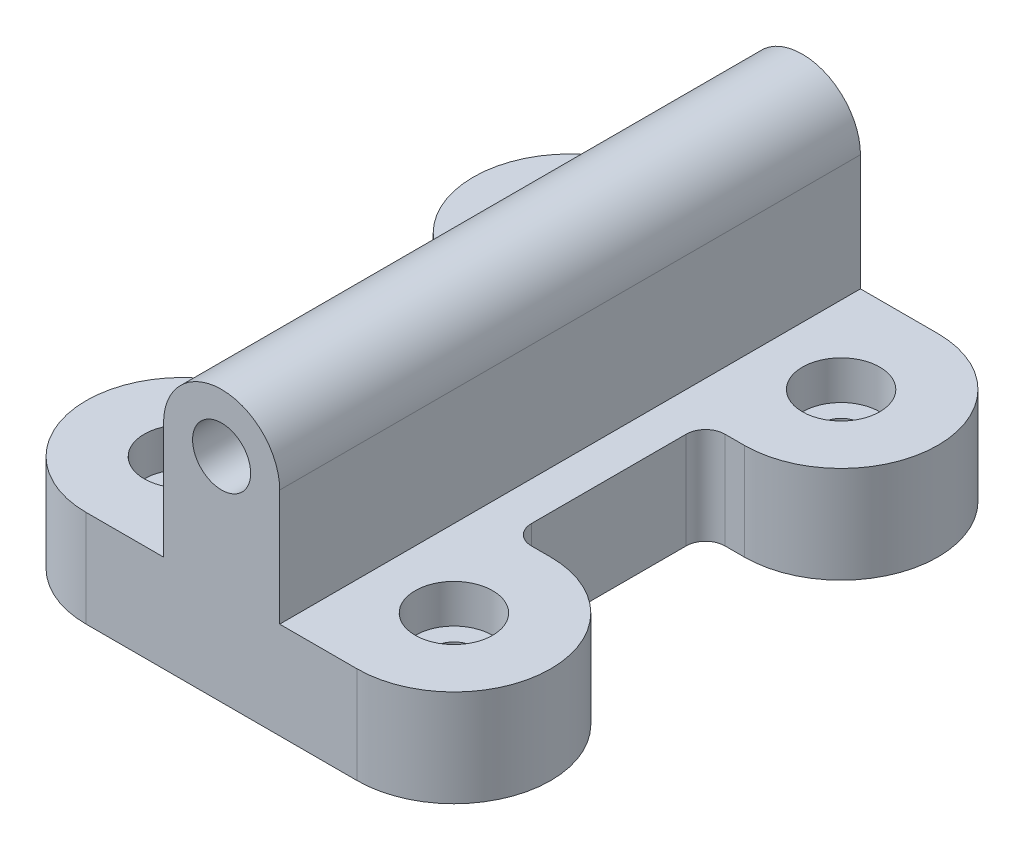
ISO-10303-21;
HEADER;
FILE_DESCRIPTION(('STEP AP214'),'2;1');
FILE_NAME('part.step','',(''),(''),'','','');
FILE_SCHEMA(('AUTOMOTIVE_DESIGN { 1 0 10303 214 1 1 1 1 }'));
ENDSEC;
DATA;
#1=APPLICATION_CONTEXT('core data for automotive mechanical design processes');
#2=APPLICATION_PROTOCOL_DEFINITION('international standard','automotive_design',2000,#1);
#3=PRODUCT_CONTEXT('',#1,'mechanical');
#4=PRODUCT('Part','Part','',(#3));
#5=PRODUCT_RELATED_PRODUCT_CATEGORY('part','',(#4));
#6=PRODUCT_DEFINITION_FORMATION('','',#4);
#7=PRODUCT_DEFINITION_CONTEXT('part definition',#1,'design');
#8=PRODUCT_DEFINITION('design','',#6,#7);
#9=PRODUCT_DEFINITION_SHAPE('','',#8);
#10=(LENGTH_UNIT() NAMED_UNIT(*) SI_UNIT(.MILLI.,.METRE.));
#11=(NAMED_UNIT(*) PLANE_ANGLE_UNIT() SI_UNIT($,.RADIAN.));
#12=(NAMED_UNIT(*) SI_UNIT($,.STERADIAN.) SOLID_ANGLE_UNIT());
#13=UNCERTAINTY_MEASURE_WITH_UNIT(LENGTH_MEASURE(1.E-05),#10,'distance_accuracy_value','');
#14=(GEOMETRIC_REPRESENTATION_CONTEXT(3) GLOBAL_UNCERTAINTY_ASSIGNED_CONTEXT((#13)) GLOBAL_UNIT_ASSIGNED_CONTEXT((#10,
#11,#12)) REPRESENTATION_CONTEXT('',''));
#15=CARTESIAN_POINT('',(0.,0.,0.));
#16=DIRECTION('',(0.,0.,1.));
#17=DIRECTION('',(1.,0.,0.));
#18=AXIS2_PLACEMENT_3D('',#15,#16,#17);
#19=CARTESIAN_POINT('',(-21.8193895180757,5.,-13.4558138102428));
#20=DIRECTION('',(0.,-1.,0.));
#21=DIRECTION('',(0.,0.,-1.));
#22=AXIS2_PLACEMENT_3D('',#19,#20,#21);
#23=CYLINDRICAL_SURFACE('',#22,1.);
#24=CARTESIAN_POINT('',(-21.8193895180757,0.,-13.4558138102428));
#25=DIRECTION('',(0.,1.,0.));
#26=DIRECTION('',(0.,0.,1.));
#27=AXIS2_PLACEMENT_3D('',#24,#25,#26);
#28=CIRCLE('',#27,1.);
#29=CARTESIAN_POINT('',(-21.8193895180757,0.,-12.4558138102428));
#30=VERTEX_POINT('',#29);
#31=EDGE_CURVE('E231',#30,#30,#28,.T.);
#32=ORIENTED_EDGE('',*,*,#31,.F.);
#33=EDGE_LOOP('',(#32));
#34=FACE_BOUND('',#33,.T.);
#35=CARTESIAN_POINT('',(-21.8193895180757,3.,-13.4558138102428));
#36=DIRECTION('',(0.,1.,0.));
#37=DIRECTION('',(0.,0.,1.));
#38=AXIS2_PLACEMENT_3D('',#35,#36,#37);
#39=CIRCLE('',#38,1.);
#40=CARTESIAN_POINT('',(-21.8193895180757,3.,-12.4558138102428));
#41=VERTEX_POINT('',#40);
#42=EDGE_CURVE('E43',#41,#41,#39,.T.);
#43=ORIENTED_EDGE('',*,*,#42,.T.);
#44=EDGE_LOOP('',(#43));
#45=FACE_BOUND('',#44,.T.);
#46=ADVANCED_FACE('F39',(#34,#45),#23,.F.);
#47=CARTESIAN_POINT('',(-7.8193895180757,5.,-13.4558138102428));
#48=DIRECTION('',(0.,-1.,0.));
#49=DIRECTION('',(0.,0.,-1.));
#50=AXIS2_PLACEMENT_3D('',#47,#48,#49);
#51=CYLINDRICAL_SURFACE('',#50,1.);
#52=CARTESIAN_POINT('',(-7.8193895180757,0.,-13.4558138102428));
#53=DIRECTION('',(0.,1.,0.));
#54=DIRECTION('',(0.,0.,1.));
#55=AXIS2_PLACEMENT_3D('',#52,#53,#54);
#56=CIRCLE('',#55,1.);
#57=CARTESIAN_POINT('',(-7.8193895180757,0.,-12.4558138102428));
#58=VERTEX_POINT('',#57);
#59=EDGE_CURVE('E228',#58,#58,#56,.T.);
#60=ORIENTED_EDGE('',*,*,#59,.F.);
#61=EDGE_LOOP('',(#60));
#62=FACE_BOUND('',#61,.T.);
#63=CARTESIAN_POINT('',(-7.8193895180757,3.,-13.4558138102428));
#64=DIRECTION('',(0.,1.,0.));
#65=DIRECTION('',(0.,0.,1.));
#66=AXIS2_PLACEMENT_3D('',#63,#64,#65);
#67=CIRCLE('',#66,1.);
#68=CARTESIAN_POINT('',(-7.8193895180757,3.,-12.4558138102428));
#69=VERTEX_POINT('',#68);
#70=EDGE_CURVE('E207',#69,#69,#67,.T.);
#71=ORIENTED_EDGE('',*,*,#70,.T.);
#72=EDGE_LOOP('',(#71));
#73=FACE_BOUND('',#72,.T.);
#74=ADVANCED_FACE('F353',(#62,#73),#51,.F.);
#75=CARTESIAN_POINT('',(-21.8193895180757,5.,-33.4558138102428));
#76=DIRECTION('',(0.,-1.,0.));
#77=DIRECTION('',(0.,0.,-1.));
#78=AXIS2_PLACEMENT_3D('',#75,#76,#77);
#79=CYLINDRICAL_SURFACE('',#78,1.);
#80=CARTESIAN_POINT('',(-21.8193895180757,0.,-33.4558138102428));
#81=DIRECTION('',(0.,1.,0.));
#82=DIRECTION('',(0.,0.,1.));
#83=AXIS2_PLACEMENT_3D('',#80,#81,#82);
#84=CIRCLE('',#83,1.);
#85=CARTESIAN_POINT('',(-21.8193895180757,0.,-32.4558138102428));
#86=VERTEX_POINT('',#85);
#87=EDGE_CURVE('E225',#86,#86,#84,.T.);
#88=ORIENTED_EDGE('',*,*,#87,.F.);
#89=EDGE_LOOP('',(#88));
#90=FACE_BOUND('',#89,.T.);
#91=CARTESIAN_POINT('',(-21.8193895180757,3.,-33.4558138102428));
#92=DIRECTION('',(0.,1.,0.));
#93=DIRECTION('',(0.,0.,1.));
#94=AXIS2_PLACEMENT_3D('',#91,#92,#93);
#95=CIRCLE('',#94,1.);
#96=CARTESIAN_POINT('',(-21.8193895180757,3.,-32.4558138102428));
#97=VERTEX_POINT('',#96);
#98=EDGE_CURVE('E347',#97,#97,#95,.T.);
#99=ORIENTED_EDGE('',*,*,#98,.T.);
#100=EDGE_LOOP('',(#99));
#101=FACE_BOUND('',#100,.T.);
#102=ADVANCED_FACE('F484',(#90,#101),#79,.F.);
#103=CARTESIAN_POINT('',(-7.8193895180757,5.,-33.4558138102428));
#104=DIRECTION('',(0.,-1.,0.));
#105=DIRECTION('',(0.,0.,-1.));
#106=AXIS2_PLACEMENT_3D('',#103,#104,#105);
#107=CYLINDRICAL_SURFACE('',#106,1.);
#108=CARTESIAN_POINT('',(-7.8193895180757,0.,-33.4558138102428));
#109=DIRECTION('',(0.,1.,0.));
#110=DIRECTION('',(0.,0.,1.));
#111=AXIS2_PLACEMENT_3D('',#108,#109,#110);
#112=CIRCLE('',#111,1.);
#113=CARTESIAN_POINT('',(-7.8193895180757,0.,-32.4558138102428));
#114=VERTEX_POINT('',#113);
#115=EDGE_CURVE('E222',#114,#114,#112,.T.);
#116=ORIENTED_EDGE('',*,*,#115,.F.);
#117=EDGE_LOOP('',(#116));
#118=FACE_BOUND('',#117,.T.);
#119=CARTESIAN_POINT('',(-7.8193895180757,3.,-33.4558138102428));
#120=DIRECTION('',(0.,1.,0.));
#121=DIRECTION('',(0.,0.,1.));
#122=AXIS2_PLACEMENT_3D('',#119,#120,#121);
#123=CIRCLE('',#122,1.);
#124=CARTESIAN_POINT('',(-7.8193895180757,3.,-32.4558138102428));
#125=VERTEX_POINT('',#124);
#126=EDGE_CURVE('E344',#125,#125,#123,.T.);
#127=ORIENTED_EDGE('',*,*,#126,.T.);
#128=EDGE_LOOP('',(#127));
#129=FACE_BOUND('',#128,.T.);
#130=ADVANCED_FACE('F667',(#118,#129),#107,.F.);
#131=CARTESIAN_POINT('',(-21.8193895180757,5.,-13.4558138102428));
#132=DIRECTION('',(0.,1.,0.));
#133=DIRECTION('',(0.,0.,1.));
#134=AXIS2_PLACEMENT_3D('',#131,#132,#133);
#135=PLANE('',#134);
#136=CARTESIAN_POINT('',(-7.8193895180757,5.,-33.4558138102428));
#137=DIRECTION('',(0.,1.,0.));
#138=DIRECTION('',(0.,0.,1.));
#139=AXIS2_PLACEMENT_3D('',#136,#137,#138);
#140=CIRCLE('',#139,2.);
#141=CARTESIAN_POINT('',(-7.8193895180757,5.,-31.4558138102428));
#142=VERTEX_POINT('',#141);
#143=EDGE_CURVE('E371',#142,#142,#140,.T.);
#144=ORIENTED_EDGE('',*,*,#143,.F.);
#145=EDGE_LOOP('',(#144));
#146=FACE_BOUND('',#145,.T.);
#147=CARTESIAN_POINT('',(-7.8193895180757,5.,-13.4558138102428));
#148=DIRECTION('',(0.,1.,0.));
#149=DIRECTION('',(0.,0.,1.));
#150=AXIS2_PLACEMENT_3D('',#147,#148,#149);
#151=CIRCLE('',#150,2.);
#152=CARTESIAN_POINT('',(-7.8193895180757,5.,-11.4558138102428));
#153=VERTEX_POINT('',#152);
#154=EDGE_CURVE('E365',#153,#153,#151,.T.);
#155=ORIENTED_EDGE('',*,*,#154,.F.);
#156=EDGE_LOOP('',(#155));
#157=FACE_BOUND('',#156,.T.);
#158=DIRECTION('',(-1.,0.,0.));
#159=VECTOR('',#158,1.);
#160=CARTESIAN_POINT('',(-21.8193895180757,5.,-38.4558138102428));
#161=LINE('',#160,#159);
#162=CARTESIAN_POINT('',(-7.8193895180757,5.,-38.4558138102428));
#163=VERTEX_POINT('',#162);
#164=CARTESIAN_POINT('',(-11.8193895180757,5.,-38.4558138102428));
#165=VERTEX_POINT('',#164);
#166=EDGE_CURVE('E64',#163,#165,#161,.T.);
#167=ORIENTED_EDGE('',*,*,#166,.T.);
#168=DIRECTION('',(0.,0.,1.));
#169=VECTOR('',#168,1.);
#170=CARTESIAN_POINT('',(-11.8193895180757,5.,-49.2724676366348));
#171=LINE('',#170,#169);
#172=CARTESIAN_POINT('',(-11.8193895180757,5.,-8.45581381024279));
#173=VERTEX_POINT('',#172);
#174=EDGE_CURVE('E214',#165,#173,#171,.T.);
#175=ORIENTED_EDGE('',*,*,#174,.T.);
#176=DIRECTION('',(1.,0.,0.));
#177=VECTOR('',#176,1.);
#178=CARTESIAN_POINT('',(-21.8193895180757,5.,-8.45581381024279));
#179=LINE('',#178,#177);
#180=CARTESIAN_POINT('',(-7.8193895180757,5.,-8.45581381024279));
#181=VERTEX_POINT('',#180);
#182=EDGE_CURVE('E204',#173,#181,#179,.T.);
#183=ORIENTED_EDGE('',*,*,#182,.T.);
#184=CARTESIAN_POINT('',(-7.8193895180757,5.,-13.4558138102428));
#185=DIRECTION('',(0.,1.,0.));
#186=DIRECTION('',(0.,0.,1.));
#187=AXIS2_PLACEMENT_3D('',#184,#185,#186);
#188=CIRCLE('',#187,5.);
#189=CARTESIAN_POINT('',(-7.8193895180757,5.,-18.4558138102428));
#190=VERTEX_POINT('',#189);
#191=EDGE_CURVE('E241',#181,#190,#188,.T.);
#192=ORIENTED_EDGE('',*,*,#191,.T.);
#193=DIRECTION('',(-1.,0.,0.));
#194=VECTOR('',#193,1.);
#195=CARTESIAN_POINT('',(-7.8193895180757,5.,-18.4558138102428));
#196=LINE('',#195,#194);
#197=CARTESIAN_POINT('',(-8.8193895180757,5.,-18.4558138102428));
#198=VERTEX_POINT('',#197);
#199=EDGE_CURVE('E243',#190,#198,#196,.T.);
#200=ORIENTED_EDGE('',*,*,#199,.T.);
#201=CARTESIAN_POINT('',(-8.8193895180757,5.,-19.4558138102428));
#202=DIRECTION('',(0.,-1.,0.));
#203=DIRECTION('',(0.,0.,1.));
#204=AXIS2_PLACEMENT_3D('',#201,#202,#203);
#205=CIRCLE('',#204,1.);
#206=CARTESIAN_POINT('',(-9.8193895180757,5.,-19.4558138102428));
#207=VERTEX_POINT('',#206);
#208=EDGE_CURVE('E245',#198,#207,#205,.T.);
#209=ORIENTED_EDGE('',*,*,#208,.T.);
#210=DIRECTION('',(0.,0.,-1.));
#211=VECTOR('',#210,1.);
#212=CARTESIAN_POINT('',(-9.8193895180757,5.,-27.4558138102428));
#213=LINE('',#212,#211);
#214=CARTESIAN_POINT('',(-9.8193895180757,5.,-27.4558138102428));
#215=VERTEX_POINT('',#214);
#216=EDGE_CURVE('E247',#207,#215,#213,.T.);
#217=ORIENTED_EDGE('',*,*,#216,.T.);
#218=CARTESIAN_POINT('',(-8.8193895180757,5.,-27.4558138102428));
#219=DIRECTION('',(0.,-1.,0.));
#220=DIRECTION('',(0.,0.,-1.));
#221=AXIS2_PLACEMENT_3D('',#218,#219,#220);
#222=CIRCLE('',#221,1.);
#223=CARTESIAN_POINT('',(-8.81938951807569,5.,-28.4558138102428));
#224=VERTEX_POINT('',#223);
#225=EDGE_CURVE('E249',#215,#224,#222,.T.);
#226=ORIENTED_EDGE('',*,*,#225,.T.);
#227=DIRECTION('',(1.,0.,0.));
#228=VECTOR('',#227,1.);
#229=CARTESIAN_POINT('',(-7.8193895180757,5.,-28.4558138102428));
#230=LINE('',#229,#228);
#231=CARTESIAN_POINT('',(-7.8193895180757,5.,-28.4558138102428));
#232=VERTEX_POINT('',#231);
#233=EDGE_CURVE('E251',#224,#232,#230,.T.);
#234=ORIENTED_EDGE('',*,*,#233,.T.);
#235=CARTESIAN_POINT('',(-7.8193895180757,5.,-33.4558138102428));
#236=DIRECTION('',(0.,1.,0.));
#237=DIRECTION('',(0.,0.,1.));
#238=AXIS2_PLACEMENT_3D('',#235,#236,#237);
#239=CIRCLE('',#238,5.);
#240=EDGE_CURVE('E253',#232,#163,#239,.T.);
#241=ORIENTED_EDGE('',*,*,#240,.T.);
#242=EDGE_LOOP('',(#167,#175,#183,#192,#200,#209,#217,#226,#234,#241));
#243=FACE_BOUND('',#242,.T.);
#244=ADVANCED_FACE('F450',(#146,#157,#243),#135,.T.);
#245=CARTESIAN_POINT('',(-21.8193895180757,5.,-13.4558138102428));
#246=DIRECTION('',(0.,1.,0.));
#247=DIRECTION('',(0.,0.,1.));
#248=AXIS2_PLACEMENT_3D('',#245,#246,#247);
#249=CIRCLE('',#248,2.);
#250=CARTESIAN_POINT('',(-21.8193895180757,5.,-11.4558138102428));
#251=VERTEX_POINT('',#250);
#252=EDGE_CURVE('E378',#251,#251,#249,.T.);
#253=ORIENTED_EDGE('',*,*,#252,.F.);
#254=EDGE_LOOP('',(#253));
#255=FACE_BOUND('',#254,.T.);
#256=CARTESIAN_POINT('',(-21.8193895180757,5.,-33.4558138102428));
#257=DIRECTION('',(0.,1.,0.));
#258=DIRECTION('',(0.,0.,1.));
#259=AXIS2_PLACEMENT_3D('',#256,#257,#258);
#260=CIRCLE('',#259,2.);
#261=CARTESIAN_POINT('',(-21.8193895180757,5.,-31.4558138102428));
#262=VERTEX_POINT('',#261);
#263=EDGE_CURVE('E374',#262,#262,#260,.T.);
#264=ORIENTED_EDGE('',*,*,#263,.F.);
#265=EDGE_LOOP('',(#264));
#266=FACE_BOUND('',#265,.T.);
#267=DIRECTION('',(0.,0.,1.));
#268=VECTOR('',#267,1.);
#269=CARTESIAN_POINT('',(-17.8193895180757,5.,-49.2724676366348));
#270=LINE('',#269,#268);
#271=CARTESIAN_POINT('',(-17.8193895180757,5.,-38.4558138102428));
#272=VERTEX_POINT('',#271);
#273=CARTESIAN_POINT('',(-17.8193895180757,5.,-8.45581381024279));
#274=VERTEX_POINT('',#273);
#275=EDGE_CURVE('E56',#272,#274,#270,.T.);
#276=ORIENTED_EDGE('',*,*,#275,.F.);
#277=CARTESIAN_POINT('',(-21.8193895180757,5.,-38.4558138102428));
#278=VERTEX_POINT('',#277);
#279=EDGE_CURVE('E255',#272,#278,#161,.T.);
#280=ORIENTED_EDGE('',*,*,#279,.T.);
#281=CARTESIAN_POINT('',(-21.8193895180757,5.,-33.4558138102428));
#282=DIRECTION('',(0.,1.,0.));
#283=DIRECTION('',(0.,0.,1.));
#284=AXIS2_PLACEMENT_3D('',#281,#282,#283);
#285=CIRCLE('',#284,5.);
#286=CARTESIAN_POINT('',(-21.8193895180757,5.,-28.4558138102428));
#287=VERTEX_POINT('',#286);
#288=EDGE_CURVE('E257',#278,#287,#285,.T.);
#289=ORIENTED_EDGE('',*,*,#288,.T.);
#290=DIRECTION('',(1.,0.,0.));
#291=VECTOR('',#290,1.);
#292=CARTESIAN_POINT('',(-21.8193895180757,5.,-28.4558138102428));
#293=LINE('',#292,#291);
#294=CARTESIAN_POINT('',(-20.8193895180757,5.,-28.4558138102428));
#295=VERTEX_POINT('',#294);
#296=EDGE_CURVE('E259',#287,#295,#293,.T.);
#297=ORIENTED_EDGE('',*,*,#296,.T.);
#298=CARTESIAN_POINT('',(-20.8193895180757,5.,-27.4558138102428));
#299=DIRECTION('',(0.,-1.,0.));
#300=DIRECTION('',(0.,0.,1.));
#301=AXIS2_PLACEMENT_3D('',#298,#299,#300);
#302=CIRCLE('',#301,1.);
#303=CARTESIAN_POINT('',(-19.8193895180757,5.,-27.4558138102428));
#304=VERTEX_POINT('',#303);
#305=EDGE_CURVE('E261',#295,#304,#302,.T.);
#306=ORIENTED_EDGE('',*,*,#305,.T.);
#307=DIRECTION('',(0.,0.,1.));
#308=VECTOR('',#307,1.);
#309=CARTESIAN_POINT('',(-19.8193895180757,5.,-19.4558138102428));
#310=LINE('',#309,#308);
#311=CARTESIAN_POINT('',(-19.8193895180757,5.,-19.4558138102428));
#312=VERTEX_POINT('',#311);
#313=EDGE_CURVE('E263',#304,#312,#310,.T.);
#314=ORIENTED_EDGE('',*,*,#313,.T.);
#315=CARTESIAN_POINT('',(-20.8193895180757,5.,-19.4558138102428));
#316=DIRECTION('',(0.,-1.,0.));
#317=DIRECTION('',(0.,0.,-1.));
#318=AXIS2_PLACEMENT_3D('',#315,#316,#317);
#319=CIRCLE('',#318,1.);
#320=CARTESIAN_POINT('',(-20.8193895180757,5.,-18.4558138102428));
#321=VERTEX_POINT('',#320);
#322=EDGE_CURVE('E265',#312,#321,#319,.T.);
#323=ORIENTED_EDGE('',*,*,#322,.T.);
#324=DIRECTION('',(-1.,0.,0.));
#325=VECTOR('',#324,1.);
#326=CARTESIAN_POINT('',(-21.8193895180757,5.,-18.4558138102428));
#327=LINE('',#326,#325);
#328=CARTESIAN_POINT('',(-21.8193895180757,5.,-18.4558138102428));
#329=VERTEX_POINT('',#328);
#330=EDGE_CURVE('E267',#321,#329,#327,.T.);
#331=ORIENTED_EDGE('',*,*,#330,.T.);
#332=CARTESIAN_POINT('',(-21.8193895180757,5.,-13.4558138102428));
#333=DIRECTION('',(0.,1.,0.));
#334=DIRECTION('',(0.,0.,1.));
#335=AXIS2_PLACEMENT_3D('',#332,#333,#334);
#336=CIRCLE('',#335,5.);
#337=CARTESIAN_POINT('',(-21.8193895180757,5.,-8.45581381024279));
#338=VERTEX_POINT('',#337);
#339=EDGE_CURVE('E235',#329,#338,#336,.T.);
#340=ORIENTED_EDGE('',*,*,#339,.T.);
#341=EDGE_CURVE('E239',#338,#274,#179,.T.);
#342=ORIENTED_EDGE('',*,*,#341,.T.);
#343=EDGE_LOOP('',(#276,#280,#289,#297,#306,#314,#323,#331,#340,#342));
#344=FACE_BOUND('',#343,.T.);
#345=ADVANCED_FACE('F396',(#255,#266,#344),#135,.T.);
#346=CARTESIAN_POINT('',(-21.8193895180757,0.,-13.4558138102428));
#347=DIRECTION('',(0.,1.,0.));
#348=DIRECTION('',(0.,0.,1.));
#349=AXIS2_PLACEMENT_3D('',#346,#347,#348);
#350=PLANE('',#349);
#351=CARTESIAN_POINT('',(-21.8193895180757,0.,-13.4558138102428));
#352=DIRECTION('',(0.,1.,0.));
#353=DIRECTION('',(0.,0.,1.));
#354=AXIS2_PLACEMENT_3D('',#351,#352,#353);
#355=CIRCLE('',#354,5.);
#356=CARTESIAN_POINT('',(-21.8193895180757,0.,-18.4558138102428));
#357=VERTEX_POINT('',#356);
#358=CARTESIAN_POINT('',(-21.8193895180757,0.,-8.45581381024279));
#359=VERTEX_POINT('',#358);
#360=EDGE_CURVE('E234',#357,#359,#355,.T.);
#361=ORIENTED_EDGE('',*,*,#360,.F.);
#362=DIRECTION('',(-1.,0.,0.));
#363=VECTOR('',#362,1.);
#364=CARTESIAN_POINT('',(-21.8193895180757,0.,-18.4558138102428));
#365=LINE('',#364,#363);
#366=CARTESIAN_POINT('',(-20.8193895180757,0.,-18.4558138102428));
#367=VERTEX_POINT('',#366);
#368=EDGE_CURVE('E238',#367,#357,#365,.T.);
#369=ORIENTED_EDGE('',*,*,#368,.F.);
#370=CARTESIAN_POINT('',(-20.8193895180757,0.,-19.4558138102428));
#371=DIRECTION('',(0.,-1.,0.));
#372=DIRECTION('',(0.,0.,-1.));
#373=AXIS2_PLACEMENT_3D('',#370,#371,#372);
#374=CIRCLE('',#373,1.);
#375=CARTESIAN_POINT('',(-19.8193895180757,0.,-19.4558138102428));
#376=VERTEX_POINT('',#375);
#377=EDGE_CURVE('E298',#376,#367,#374,.T.);
#378=ORIENTED_EDGE('',*,*,#377,.F.);
#379=DIRECTION('',(0.,0.,1.));
#380=VECTOR('',#379,1.);
#381=CARTESIAN_POINT('',(-19.8193895180757,0.,-19.4558138102428));
#382=LINE('',#381,#380);
#383=CARTESIAN_POINT('',(-19.8193895180757,0.,-27.4558138102428));
#384=VERTEX_POINT('',#383);
#385=EDGE_CURVE('E296',#384,#376,#382,.T.);
#386=ORIENTED_EDGE('',*,*,#385,.F.);
#387=CARTESIAN_POINT('',(-20.8193895180757,0.,-27.4558138102428));
#388=DIRECTION('',(0.,-1.,0.));
#389=DIRECTION('',(0.,0.,1.));
#390=AXIS2_PLACEMENT_3D('',#387,#388,#389);
#391=CIRCLE('',#390,1.);
#392=CARTESIAN_POINT('',(-20.8193895180757,0.,-28.4558138102428));
#393=VERTEX_POINT('',#392);
#394=EDGE_CURVE('E294',#393,#384,#391,.T.);
#395=ORIENTED_EDGE('',*,*,#394,.F.);
#396=DIRECTION('',(1.,0.,0.));
#397=VECTOR('',#396,1.);
#398=CARTESIAN_POINT('',(-21.8193895180757,0.,-28.4558138102428));
#399=LINE('',#398,#397);
#400=CARTESIAN_POINT('',(-21.8193895180757,0.,-28.4558138102428));
#401=VERTEX_POINT('',#400);
#402=EDGE_CURVE('E292',#401,#393,#399,.T.);
#403=ORIENTED_EDGE('',*,*,#402,.F.);
#404=CARTESIAN_POINT('',(-21.8193895180757,0.,-33.4558138102428));
#405=DIRECTION('',(0.,1.,0.));
#406=DIRECTION('',(0.,0.,1.));
#407=AXIS2_PLACEMENT_3D('',#404,#405,#406);
#408=CIRCLE('',#407,5.);
#409=CARTESIAN_POINT('',(-21.8193895180757,0.,-38.4558138102428));
#410=VERTEX_POINT('',#409);
#411=EDGE_CURVE('E290',#410,#401,#408,.T.);
#412=ORIENTED_EDGE('',*,*,#411,.F.);
#413=DIRECTION('',(-1.,0.,0.));
#414=VECTOR('',#413,1.);
#415=CARTESIAN_POINT('',(-21.8193895180757,0.,-38.4558138102428));
#416=LINE('',#415,#414);
#417=CARTESIAN_POINT('',(-7.8193895180757,0.,-38.4558138102428));
#418=VERTEX_POINT('',#417);
#419=EDGE_CURVE('E288',#418,#410,#416,.T.);
#420=ORIENTED_EDGE('',*,*,#419,.F.);
#421=CARTESIAN_POINT('',(-7.8193895180757,0.,-33.4558138102428));
#422=DIRECTION('',(0.,1.,0.));
#423=DIRECTION('',(0.,0.,1.));
#424=AXIS2_PLACEMENT_3D('',#421,#422,#423);
#425=CIRCLE('',#424,5.);
#426=CARTESIAN_POINT('',(-7.8193895180757,0.,-28.4558138102428));
#427=VERTEX_POINT('',#426);
#428=EDGE_CURVE('E286',#427,#418,#425,.T.);
#429=ORIENTED_EDGE('',*,*,#428,.F.);
#430=DIRECTION('',(1.,0.,0.));
#431=VECTOR('',#430,1.);
#432=CARTESIAN_POINT('',(-7.8193895180757,0.,-28.4558138102428));
#433=LINE('',#432,#431);
#434=CARTESIAN_POINT('',(-8.81938951807569,0.,-28.4558138102428));
#435=VERTEX_POINT('',#434);
#436=EDGE_CURVE('E284',#435,#427,#433,.T.);
#437=ORIENTED_EDGE('',*,*,#436,.F.);
#438=CARTESIAN_POINT('',(-8.8193895180757,0.,-27.4558138102428));
#439=DIRECTION('',(0.,-1.,0.));
#440=DIRECTION('',(0.,0.,-1.));
#441=AXIS2_PLACEMENT_3D('',#438,#439,#440);
#442=CIRCLE('',#441,1.);
#443=CARTESIAN_POINT('',(-9.8193895180757,0.,-27.4558138102428));
#444=VERTEX_POINT('',#443);
#445=EDGE_CURVE('E282',#444,#435,#442,.T.);
#446=ORIENTED_EDGE('',*,*,#445,.F.);
#447=DIRECTION('',(0.,0.,-1.));
#448=VECTOR('',#447,1.);
#449=CARTESIAN_POINT('',(-9.8193895180757,0.,-27.4558138102428));
#450=LINE('',#449,#448);
#451=CARTESIAN_POINT('',(-9.8193895180757,0.,-19.4558138102428));
#452=VERTEX_POINT('',#451);
#453=EDGE_CURVE('E280',#452,#444,#450,.T.);
#454=ORIENTED_EDGE('',*,*,#453,.F.);
#455=CARTESIAN_POINT('',(-8.8193895180757,0.,-19.4558138102428));
#456=DIRECTION('',(0.,-1.,0.));
#457=DIRECTION('',(0.,0.,1.));
#458=AXIS2_PLACEMENT_3D('',#455,#456,#457);
#459=CIRCLE('',#458,1.);
#460=CARTESIAN_POINT('',(-8.8193895180757,0.,-18.4558138102428));
#461=VERTEX_POINT('',#460);
#462=EDGE_CURVE('E278',#461,#452,#459,.T.);
#463=ORIENTED_EDGE('',*,*,#462,.F.);
#464=DIRECTION('',(-1.,0.,0.));
#465=VECTOR('',#464,1.);
#466=CARTESIAN_POINT('',(-7.8193895180757,0.,-18.4558138102428));
#467=LINE('',#466,#465);
#468=CARTESIAN_POINT('',(-7.8193895180757,0.,-18.4558138102428));
#469=VERTEX_POINT('',#468);
#470=EDGE_CURVE('E276',#469,#461,#467,.T.);
#471=ORIENTED_EDGE('',*,*,#470,.F.);
#472=CARTESIAN_POINT('',(-7.8193895180757,0.,-13.4558138102428));
#473=DIRECTION('',(0.,1.,0.));
#474=DIRECTION('',(0.,0.,1.));
#475=AXIS2_PLACEMENT_3D('',#472,#473,#474);
#476=CIRCLE('',#475,5.);
#477=CARTESIAN_POINT('',(-7.8193895180757,0.,-8.45581381024279));
#478=VERTEX_POINT('',#477);
#479=EDGE_CURVE('E274',#478,#469,#476,.T.);
#480=ORIENTED_EDGE('',*,*,#479,.F.);
#481=DIRECTION('',(1.,0.,0.));
#482=VECTOR('',#481,1.);
#483=CARTESIAN_POINT('',(-21.8193895180757,0.,-8.45581381024279));
#484=LINE('',#483,#482);
#485=EDGE_CURVE('E272',#359,#478,#484,.T.);
#486=ORIENTED_EDGE('',*,*,#485,.F.);
#487=EDGE_LOOP('',(#361,#369,#378,#386,#395,#403,#412,#420,#429,#437,#446,#454,#463,#471,#480,#486));
#488=FACE_BOUND('',#487,.T.);
#489=ORIENTED_EDGE('',*,*,#31,.T.);
#490=EDGE_LOOP('',(#489));
#491=FACE_BOUND('',#490,.T.);
#492=ORIENTED_EDGE('',*,*,#59,.T.);
#493=EDGE_LOOP('',(#492));
#494=FACE_BOUND('',#493,.T.);
#495=ORIENTED_EDGE('',*,*,#87,.T.);
#496=EDGE_LOOP('',(#495));
#497=FACE_BOUND('',#496,.T.);
#498=ORIENTED_EDGE('',*,*,#115,.T.);
#499=EDGE_LOOP('',(#498));
#500=FACE_BOUND('',#499,.T.);
#501=ADVANCED_FACE('F437',(#488,#491,#494,#497,#500),#350,.F.);
#502=CARTESIAN_POINT('',(-21.8193895180757,5.,-13.4558138102428));
#503=DIRECTION('',(0.,-1.,0.));
#504=DIRECTION('',(0.,0.,-1.));
#505=AXIS2_PLACEMENT_3D('',#502,#503,#504);
#506=CYLINDRICAL_SURFACE('',#505,5.);
#507=ORIENTED_EDGE('',*,*,#360,.T.);
#508=DIRECTION('',(0.,-1.,0.));
#509=VECTOR('',#508,1.);
#510=CARTESIAN_POINT('',(-21.8193895180757,5.,-8.45581381024279));
#511=LINE('',#510,#509);
#512=EDGE_CURVE('E11',#338,#359,#511,.T.);
#513=ORIENTED_EDGE('',*,*,#512,.F.);
#514=ORIENTED_EDGE('',*,*,#339,.F.);
#515=DIRECTION('',(0.,-1.,0.));
#516=VECTOR('',#515,1.);
#517=CARTESIAN_POINT('',(-21.8193895180757,5.,-18.4558138102428));
#518=LINE('',#517,#516);
#519=EDGE_CURVE('E269',#329,#357,#518,.T.);
#520=ORIENTED_EDGE('',*,*,#519,.T.);
#521=EDGE_LOOP('',(#507,#513,#514,#520));
#522=FACE_BOUND('',#521,.T.);
#523=ADVANCED_FACE('F41',(#522),#506,.T.);
#524=CARTESIAN_POINT('',(-21.8193895180757,5.,-8.45581381024279));
#525=DIRECTION('',(0.,0.,-1.));
#526=DIRECTION('',(-1.,0.,0.));
#527=AXIS2_PLACEMENT_3D('',#524,#525,#526);
#528=PLANE('',#527);
#529=ORIENTED_EDGE('',*,*,#485,.T.);
#530=DIRECTION('',(0.,-1.,0.));
#531=VECTOR('',#530,1.);
#532=CARTESIAN_POINT('',(-7.8193895180757,5.,-8.45581381024279));
#533=LINE('',#532,#531);
#534=EDGE_CURVE('E48',#181,#478,#533,.T.);
#535=ORIENTED_EDGE('',*,*,#534,.F.);
#536=ORIENTED_EDGE('',*,*,#182,.F.);
#537=DIRECTION('',(0.,-1.,0.));
#538=VECTOR('',#537,1.);
#539=CARTESIAN_POINT('',(-11.8193895180757,0.,-8.45581381024279));
#540=LINE('',#539,#538);
#541=CARTESIAN_POINT('',(-11.8193895180757,11.,-8.45581381024279));
#542=VERTEX_POINT('',#541);
#543=EDGE_CURVE('E184',#542,#173,#540,.T.);
#544=ORIENTED_EDGE('',*,*,#543,.F.);
#545=CARTESIAN_POINT('',(-14.8193895180757,11.,-8.45581381024279));
#546=DIRECTION('',(0.,0.,1.));
#547=DIRECTION('',(1.,0.,0.));
#548=AXIS2_PLACEMENT_3D('',#545,#546,#547);
#549=CIRCLE('',#548,3.);
#550=CARTESIAN_POINT('',(-17.8193895180757,11.,-8.45581381024279));
#551=VERTEX_POINT('',#550);
#552=EDGE_CURVE('E192',#551,#542,#549,.F.);
#553=ORIENTED_EDGE('',*,*,#552,.F.);
#554=DIRECTION('',(0.,1.,0.));
#555=VECTOR('',#554,1.);
#556=CARTESIAN_POINT('',(-17.8193895180757,0.,-8.45581381024279));
#557=LINE('',#556,#555);
#558=EDGE_CURVE('E198',#274,#551,#557,.T.);
#559=ORIENTED_EDGE('',*,*,#558,.F.);
#560=ORIENTED_EDGE('',*,*,#341,.F.);
#561=ORIENTED_EDGE('',*,*,#512,.T.);
#562=EDGE_LOOP('',(#529,#535,#536,#544,#553,#559,#560,#561));
#563=FACE_BOUND('',#562,.T.);
#564=CARTESIAN_POINT('',(-14.8193895180757,11.,-8.45581381024279));
#565=DIRECTION('',(0.,0.,1.));
#566=DIRECTION('',(1.,0.,0.));
#567=AXIS2_PLACEMENT_3D('',#564,#565,#566);
#568=CIRCLE('',#567,1.5);
#569=CARTESIAN_POINT('',(-13.3193895180757,11.,-8.45581381024279));
#570=VERTEX_POINT('',#569);
#571=EDGE_CURVE('E189',#570,#570,#568,.T.);
#572=ORIENTED_EDGE('',*,*,#571,.F.);
#573=EDGE_LOOP('',(#572));
#574=FACE_BOUND('',#573,.T.);
#575=ADVANCED_FACE('F201',(#563,#574),#528,.F.);
#576=CARTESIAN_POINT('',(-7.8193895180757,5.,-13.4558138102428));
#577=DIRECTION('',(0.,-1.,0.));
#578=DIRECTION('',(0.,0.,-1.));
#579=AXIS2_PLACEMENT_3D('',#576,#577,#578);
#580=CYLINDRICAL_SURFACE('',#579,5.);
#581=ORIENTED_EDGE('',*,*,#479,.T.);
#582=DIRECTION('',(0.,-1.,0.));
#583=VECTOR('',#582,1.);
#584=CARTESIAN_POINT('',(-7.8193895180757,5.,-18.4558138102428));
#585=LINE('',#584,#583);
#586=EDGE_CURVE('E339',#190,#469,#585,.T.);
#587=ORIENTED_EDGE('',*,*,#586,.F.);
#588=ORIENTED_EDGE('',*,*,#191,.F.);
#589=ORIENTED_EDGE('',*,*,#534,.T.);
#590=EDGE_LOOP('',(#581,#587,#588,#589));
#591=FACE_BOUND('',#590,.T.);
#592=ADVANCED_FACE('F434',(#591),#580,.T.);
#593=CARTESIAN_POINT('',(-7.8193895180757,5.,-18.4558138102428));
#594=DIRECTION('',(0.,0.,1.));
#595=DIRECTION('',(1.,0.,0.));
#596=AXIS2_PLACEMENT_3D('',#593,#594,#595);
#597=PLANE('',#596);
#598=ORIENTED_EDGE('',*,*,#470,.T.);
#599=DIRECTION('',(0.,-1.,0.));
#600=VECTOR('',#599,1.);
#601=CARTESIAN_POINT('',(-8.8193895180757,5.,-18.4558138102428));
#602=LINE('',#601,#600);
#603=EDGE_CURVE('E336',#198,#461,#602,.T.);
#604=ORIENTED_EDGE('',*,*,#603,.F.);
#605=ORIENTED_EDGE('',*,*,#199,.F.);
#606=ORIENTED_EDGE('',*,*,#586,.T.);
#607=EDGE_LOOP('',(#598,#604,#605,#606));
#608=FACE_BOUND('',#607,.T.);
#609=ADVANCED_FACE('F443',(#608),#597,.F.);
#610=CARTESIAN_POINT('',(-8.8193895180757,5.,-19.4558138102428));
#611=DIRECTION('',(0.,-1.,0.));
#612=DIRECTION('',(0.,0.,-1.));
#613=AXIS2_PLACEMENT_3D('',#610,#611,#612);
#614=CYLINDRICAL_SURFACE('',#613,1.);
#615=ORIENTED_EDGE('',*,*,#462,.T.);
#616=DIRECTION('',(0.,-1.,0.));
#617=VECTOR('',#616,1.);
#618=CARTESIAN_POINT('',(-9.8193895180757,5.,-19.4558138102428));
#619=LINE('',#618,#617);
#620=EDGE_CURVE('E333',#207,#452,#619,.T.);
#621=ORIENTED_EDGE('',*,*,#620,.F.);
#622=ORIENTED_EDGE('',*,*,#208,.F.);
#623=ORIENTED_EDGE('',*,*,#603,.T.);
#624=EDGE_LOOP('',(#615,#621,#622,#623));
#625=FACE_BOUND('',#624,.T.);
#626=ADVANCED_FACE('F447',(#625),#614,.F.);
#627=CARTESIAN_POINT('',(-9.8193895180757,5.,-27.4558138102428));
#628=DIRECTION('',(-1.,0.,0.));
#629=DIRECTION('',(0.,0.,1.));
#630=AXIS2_PLACEMENT_3D('',#627,#628,#629);
#631=PLANE('',#630);
#632=ORIENTED_EDGE('',*,*,#453,.T.);
#633=DIRECTION('',(0.,-1.,0.));
#634=VECTOR('',#633,1.);
#635=CARTESIAN_POINT('',(-9.8193895180757,5.,-27.4558138102428));
#636=LINE('',#635,#634);
#637=EDGE_CURVE('E330',#215,#444,#636,.T.);
#638=ORIENTED_EDGE('',*,*,#637,.F.);
#639=ORIENTED_EDGE('',*,*,#216,.F.);
#640=ORIENTED_EDGE('',*,*,#620,.T.);
#641=EDGE_LOOP('',(#632,#638,#639,#640));
#642=FACE_BOUND('',#641,.T.);
#643=ADVANCED_FACE('F455',(#642),#631,.F.);
#644=CARTESIAN_POINT('',(-8.8193895180757,5.,-27.4558138102428));
#645=DIRECTION('',(0.,-1.,0.));
#646=DIRECTION('',(0.,0.,-1.));
#647=AXIS2_PLACEMENT_3D('',#644,#645,#646);
#648=CYLINDRICAL_SURFACE('',#647,1.);
#649=ORIENTED_EDGE('',*,*,#445,.T.);
#650=DIRECTION('',(0.,-1.,0.));
#651=VECTOR('',#650,1.);
#652=CARTESIAN_POINT('',(-8.81938951807569,5.,-28.4558138102428));
#653=LINE('',#652,#651);
#654=EDGE_CURVE('E327',#224,#435,#653,.T.);
#655=ORIENTED_EDGE('',*,*,#654,.F.);
#656=ORIENTED_EDGE('',*,*,#225,.F.);
#657=ORIENTED_EDGE('',*,*,#637,.T.);
#658=EDGE_LOOP('',(#649,#655,#656,#657));
#659=FACE_BOUND('',#658,.T.);
#660=ADVANCED_FACE('F458',(#659),#648,.F.);
#661=CARTESIAN_POINT('',(-7.8193895180757,5.,-28.4558138102428));
#662=DIRECTION('',(0.,0.,-1.));
#663=DIRECTION('',(-1.,0.,0.));
#664=AXIS2_PLACEMENT_3D('',#661,#662,#663);
#665=PLANE('',#664);
#666=ORIENTED_EDGE('',*,*,#436,.T.);
#667=DIRECTION('',(0.,-1.,0.));
#668=VECTOR('',#667,1.);
#669=CARTESIAN_POINT('',(-7.8193895180757,5.,-28.4558138102428));
#670=LINE('',#669,#668);
#671=EDGE_CURVE('E324',#232,#427,#670,.T.);
#672=ORIENTED_EDGE('',*,*,#671,.F.);
#673=ORIENTED_EDGE('',*,*,#233,.F.);
#674=ORIENTED_EDGE('',*,*,#654,.T.);
#675=EDGE_LOOP('',(#666,#672,#673,#674));
#676=FACE_BOUND('',#675,.T.);
#677=ADVANCED_FACE('F463',(#676),#665,.F.);
#678=CARTESIAN_POINT('',(-7.8193895180757,5.,-33.4558138102428));
#679=DIRECTION('',(0.,-1.,0.));
#680=DIRECTION('',(0.,0.,-1.));
#681=AXIS2_PLACEMENT_3D('',#678,#679,#680);
#682=CYLINDRICAL_SURFACE('',#681,5.);
#683=ORIENTED_EDGE('',*,*,#428,.T.);
#684=DIRECTION('',(0.,-1.,0.));
#685=VECTOR('',#684,1.);
#686=CARTESIAN_POINT('',(-7.8193895180757,5.,-38.4558138102428));
#687=LINE('',#686,#685);
#688=EDGE_CURVE('E321',#163,#418,#687,.T.);
#689=ORIENTED_EDGE('',*,*,#688,.F.);
#690=ORIENTED_EDGE('',*,*,#240,.F.);
#691=ORIENTED_EDGE('',*,*,#671,.T.);
#692=EDGE_LOOP('',(#683,#689,#690,#691));
#693=FACE_BOUND('',#692,.T.);
#694=ADVANCED_FACE('F467',(#693),#682,.T.);
#695=CARTESIAN_POINT('',(-21.8193895180757,5.,-38.4558138102428));
#696=DIRECTION('',(0.,0.,1.));
#697=DIRECTION('',(1.,0.,0.));
#698=AXIS2_PLACEMENT_3D('',#695,#696,#697);
#699=PLANE('',#698);
#700=ORIENTED_EDGE('',*,*,#419,.T.);
#701=DIRECTION('',(0.,-1.,0.));
#702=VECTOR('',#701,1.);
#703=CARTESIAN_POINT('',(-21.8193895180757,5.,-38.4558138102428));
#704=LINE('',#703,#702);
#705=EDGE_CURVE('E318',#278,#410,#704,.T.);
#706=ORIENTED_EDGE('',*,*,#705,.F.);
#707=ORIENTED_EDGE('',*,*,#279,.F.);
#708=DIRECTION('',(0.,-1.,0.));
#709=VECTOR('',#708,1.);
#710=CARTESIAN_POINT('',(-17.8193895180757,0.,-38.4558138102428));
#711=LINE('',#710,#709);
#712=CARTESIAN_POINT('',(-17.8193895180757,11.,-38.4558138102428));
#713=VERTEX_POINT('',#712);
#714=EDGE_CURVE('E387',#713,#272,#711,.T.);
#715=ORIENTED_EDGE('',*,*,#714,.F.);
#716=CARTESIAN_POINT('',(-14.8193895180757,11.,-38.4558138102428));
#717=DIRECTION('',(0.,0.,1.));
#718=DIRECTION('',(1.,0.,0.));
#719=AXIS2_PLACEMENT_3D('',#716,#717,#718);
#720=CIRCLE('',#719,3.);
#721=CARTESIAN_POINT('',(-11.8193895180757,11.,-38.4558138102428));
#722=VERTEX_POINT('',#721);
#723=EDGE_CURVE('E216',#722,#713,#720,.T.);
#724=ORIENTED_EDGE('',*,*,#723,.F.);
#725=DIRECTION('',(0.,1.,0.));
#726=VECTOR('',#725,1.);
#727=CARTESIAN_POINT('',(-11.8193895180757,0.,-38.4558138102428));
#728=LINE('',#727,#726);
#729=EDGE_CURVE('E185',#165,#722,#728,.T.);
#730=ORIENTED_EDGE('',*,*,#729,.F.);
#731=ORIENTED_EDGE('',*,*,#166,.F.);
#732=ORIENTED_EDGE('',*,*,#688,.T.);
#733=EDGE_LOOP('',(#700,#706,#707,#715,#724,#730,#731,#732));
#734=FACE_BOUND('',#733,.T.);
#735=CARTESIAN_POINT('',(-14.8193895180757,11.,-38.4558138102428));
#736=DIRECTION('',(0.,0.,1.));
#737=DIRECTION('',(1.,0.,0.));
#738=AXIS2_PLACEMENT_3D('',#735,#736,#737);
#739=CIRCLE('',#738,1.5);
#740=CARTESIAN_POINT('',(-13.3193895180757,11.,-38.4558138102428));
#741=VERTEX_POINT('',#740);
#742=EDGE_CURVE('E219',#741,#741,#739,.F.);
#743=ORIENTED_EDGE('',*,*,#742,.F.);
#744=EDGE_LOOP('',(#743));
#745=FACE_BOUND('',#744,.T.);
#746=ADVANCED_FACE('F392',(#734,#745),#699,.F.);
#747=CARTESIAN_POINT('',(-21.8193895180757,5.,-33.4558138102428));
#748=DIRECTION('',(0.,-1.,0.));
#749=DIRECTION('',(0.,0.,-1.));
#750=AXIS2_PLACEMENT_3D('',#747,#748,#749);
#751=CYLINDRICAL_SURFACE('',#750,5.);
#752=ORIENTED_EDGE('',*,*,#411,.T.);
#753=DIRECTION('',(0.,-1.,0.));
#754=VECTOR('',#753,1.);
#755=CARTESIAN_POINT('',(-21.8193895180757,5.,-28.4558138102428));
#756=LINE('',#755,#754);
#757=EDGE_CURVE('E315',#287,#401,#756,.T.);
#758=ORIENTED_EDGE('',*,*,#757,.F.);
#759=ORIENTED_EDGE('',*,*,#288,.F.);
#760=ORIENTED_EDGE('',*,*,#705,.T.);
#761=EDGE_LOOP('',(#752,#758,#759,#760));
#762=FACE_BOUND('',#761,.T.);
#763=ADVANCED_FACE('F401',(#762),#751,.T.);
#764=CARTESIAN_POINT('',(-21.8193895180757,5.,-28.4558138102428));
#765=DIRECTION('',(0.,0.,-1.));
#766=DIRECTION('',(-1.,0.,0.));
#767=AXIS2_PLACEMENT_3D('',#764,#765,#766);
#768=PLANE('',#767);
#769=ORIENTED_EDGE('',*,*,#402,.T.);
#770=DIRECTION('',(0.,-1.,0.));
#771=VECTOR('',#770,1.);
#772=CARTESIAN_POINT('',(-20.8193895180757,5.,-28.4558138102428));
#773=LINE('',#772,#771);
#774=EDGE_CURVE('E312',#295,#393,#773,.T.);
#775=ORIENTED_EDGE('',*,*,#774,.F.);
#776=ORIENTED_EDGE('',*,*,#296,.F.);
#777=ORIENTED_EDGE('',*,*,#757,.T.);
#778=EDGE_LOOP('',(#769,#775,#776,#777));
#779=FACE_BOUND('',#778,.T.);
#780=ADVANCED_FACE('F405',(#779),#768,.F.);
#781=CARTESIAN_POINT('',(-20.8193895180757,5.,-27.4558138102428));
#782=DIRECTION('',(0.,-1.,0.));
#783=DIRECTION('',(0.,0.,-1.));
#784=AXIS2_PLACEMENT_3D('',#781,#782,#783);
#785=CYLINDRICAL_SURFACE('',#784,1.);
#786=ORIENTED_EDGE('',*,*,#394,.T.);
#787=DIRECTION('',(0.,-1.,0.));
#788=VECTOR('',#787,1.);
#789=CARTESIAN_POINT('',(-19.8193895180757,5.,-27.4558138102428));
#790=LINE('',#789,#788);
#791=EDGE_CURVE('E309',#304,#384,#790,.T.);
#792=ORIENTED_EDGE('',*,*,#791,.F.);
#793=ORIENTED_EDGE('',*,*,#305,.F.);
#794=ORIENTED_EDGE('',*,*,#774,.T.);
#795=EDGE_LOOP('',(#786,#792,#793,#794));
#796=FACE_BOUND('',#795,.T.);
#797=ADVANCED_FACE('F410',(#796),#785,.F.);
#798=CARTESIAN_POINT('',(-19.8193895180757,5.,-19.4558138102428));
#799=DIRECTION('',(1.,0.,0.));
#800=DIRECTION('',(0.,0.,-1.));
#801=AXIS2_PLACEMENT_3D('',#798,#799,#800);
#802=PLANE('',#801);
#803=ORIENTED_EDGE('',*,*,#385,.T.);
#804=DIRECTION('',(0.,-1.,0.));
#805=VECTOR('',#804,1.);
#806=CARTESIAN_POINT('',(-19.8193895180757,5.,-19.4558138102428));
#807=LINE('',#806,#805);
#808=EDGE_CURVE('E306',#312,#376,#807,.T.);
#809=ORIENTED_EDGE('',*,*,#808,.F.);
#810=ORIENTED_EDGE('',*,*,#313,.F.);
#811=ORIENTED_EDGE('',*,*,#791,.T.);
#812=EDGE_LOOP('',(#803,#809,#810,#811));
#813=FACE_BOUND('',#812,.T.);
#814=ADVANCED_FACE('F416',(#813),#802,.F.);
#815=CARTESIAN_POINT('',(-20.8193895180757,5.,-19.4558138102428));
#816=DIRECTION('',(0.,-1.,0.));
#817=DIRECTION('',(0.,0.,-1.));
#818=AXIS2_PLACEMENT_3D('',#815,#816,#817);
#819=CYLINDRICAL_SURFACE('',#818,1.);
#820=ORIENTED_EDGE('',*,*,#377,.T.);
#821=DIRECTION('',(0.,-1.,0.));
#822=VECTOR('',#821,1.);
#823=CARTESIAN_POINT('',(-20.8193895180757,5.,-18.4558138102428));
#824=LINE('',#823,#822);
#825=EDGE_CURVE('E303',#321,#367,#824,.T.);
#826=ORIENTED_EDGE('',*,*,#825,.F.);
#827=ORIENTED_EDGE('',*,*,#322,.F.);
#828=ORIENTED_EDGE('',*,*,#808,.T.);
#829=EDGE_LOOP('',(#820,#826,#827,#828));
#830=FACE_BOUND('',#829,.T.);
#831=ADVANCED_FACE('F420',(#830),#819,.F.);
#832=CARTESIAN_POINT('',(-21.8193895180757,5.,-18.4558138102428));
#833=DIRECTION('',(0.,0.,1.));
#834=DIRECTION('',(1.,0.,0.));
#835=AXIS2_PLACEMENT_3D('',#832,#833,#834);
#836=PLANE('',#835);
#837=ORIENTED_EDGE('',*,*,#368,.T.);
#838=ORIENTED_EDGE('',*,*,#519,.F.);
#839=ORIENTED_EDGE('',*,*,#330,.F.);
#840=ORIENTED_EDGE('',*,*,#825,.T.);
#841=EDGE_LOOP('',(#837,#838,#839,#840));
#842=FACE_BOUND('',#841,.T.);
#843=ADVANCED_FACE('F425',(#842),#836,.F.);
#844=CARTESIAN_POINT('',(-14.8193895180757,11.,-49.2724676366348));
#845=DIRECTION('',(0.,0.,1.));
#846=DIRECTION('',(1.,0.,0.));
#847=AXIS2_PLACEMENT_3D('',#844,#845,#846);
#848=CYLINDRICAL_SURFACE('',#847,3.);
#849=DIRECTION('',(0.,0.,1.));
#850=VECTOR('',#849,1.);
#851=CARTESIAN_POINT('',(-11.8193895180757,11.,-49.2724676366348));
#852=LINE('',#851,#850);
#853=EDGE_CURVE('E179',#722,#542,#852,.T.);
#854=ORIENTED_EDGE('',*,*,#853,.F.);
#855=ORIENTED_EDGE('',*,*,#723,.T.);
#856=DIRECTION('',(0.,0.,1.));
#857=VECTOR('',#856,1.);
#858=CARTESIAN_POINT('',(-17.8193895180757,11.,-49.2724676366348));
#859=LINE('',#858,#857);
#860=EDGE_CURVE('E188',#713,#551,#859,.T.);
#861=ORIENTED_EDGE('',*,*,#860,.T.);
#862=ORIENTED_EDGE('',*,*,#552,.T.);
#863=EDGE_LOOP('',(#854,#855,#861,#862));
#864=FACE_BOUND('',#863,.T.);
#865=ADVANCED_FACE('F193',(#864),#848,.T.);
#866=CARTESIAN_POINT('',(-17.8193895180757,0.,-49.2724676366348));
#867=DIRECTION('',(1.,0.,0.));
#868=DIRECTION('',(0.,0.,-1.));
#869=AXIS2_PLACEMENT_3D('',#866,#867,#868);
#870=PLANE('',#869);
#871=ORIENTED_EDGE('',*,*,#860,.F.);
#872=ORIENTED_EDGE('',*,*,#714,.T.);
#873=ORIENTED_EDGE('',*,*,#275,.T.);
#874=ORIENTED_EDGE('',*,*,#558,.T.);
#875=EDGE_LOOP('',(#871,#872,#873,#874));
#876=FACE_BOUND('',#875,.T.);
#877=ADVANCED_FACE('F390',(#876),#870,.F.);
#878=CARTESIAN_POINT('',(-11.8193895180757,0.,-49.2724676366348));
#879=DIRECTION('',(-1.,0.,0.));
#880=DIRECTION('',(0.,-1.,0.));
#881=AXIS2_PLACEMENT_3D('',#878,#879,#880);
#882=PLANE('',#881);
#883=ORIENTED_EDGE('',*,*,#174,.F.);
#884=ORIENTED_EDGE('',*,*,#729,.T.);
#885=ORIENTED_EDGE('',*,*,#853,.T.);
#886=ORIENTED_EDGE('',*,*,#543,.T.);
#887=EDGE_LOOP('',(#883,#884,#885,#886));
#888=FACE_BOUND('',#887,.T.);
#889=ADVANCED_FACE('F182',(#888),#882,.F.);
#890=CARTESIAN_POINT('',(-14.8193895180757,11.,-49.2724676366348));
#891=DIRECTION('',(0.,0.,1.));
#892=DIRECTION('',(1.,0.,0.));
#893=AXIS2_PLACEMENT_3D('',#890,#891,#892);
#894=CYLINDRICAL_SURFACE('',#893,1.5);
#895=ORIENTED_EDGE('',*,*,#742,.T.);
#896=EDGE_LOOP('',(#895));
#897=FACE_BOUND('',#896,.T.);
#898=ORIENTED_EDGE('',*,*,#571,.T.);
#899=EDGE_LOOP('',(#898));
#900=FACE_BOUND('',#899,.T.);
#901=ADVANCED_FACE('F550',(#897,#900),#894,.F.);
#902=CARTESIAN_POINT('',(-7.8193895180757,3.,-33.4558138102428));
#903=DIRECTION('',(0.,1.,0.));
#904=DIRECTION('',(0.,0.,1.));
#905=AXIS2_PLACEMENT_3D('',#902,#903,#904);
#906=CYLINDRICAL_SURFACE('',#905,2.);
#907=CARTESIAN_POINT('',(-7.8193895180757,3.,-33.4558138102428));
#908=DIRECTION('',(0.,1.,0.));
#909=DIRECTION('',(0.,0.,1.));
#910=AXIS2_PLACEMENT_3D('',#907,#908,#909);
#911=CIRCLE('',#910,2.);
#912=CARTESIAN_POINT('',(-7.8193895180757,3.,-31.4558138102428));
#913=VERTEX_POINT('',#912);
#914=EDGE_CURVE('E375',#913,#913,#911,.T.);
#915=ORIENTED_EDGE('',*,*,#914,.F.);
#916=EDGE_LOOP('',(#915));
#917=FACE_BOUND('',#916,.T.);
#918=ORIENTED_EDGE('',*,*,#143,.T.);
#919=EDGE_LOOP('',(#918));
#920=FACE_BOUND('',#919,.T.);
#921=ADVANCED_FACE('F557',(#917,#920),#906,.F.);
#922=CARTESIAN_POINT('',(-7.8193895180757,3.,-33.4558138102428));
#923=DIRECTION('',(0.,1.,0.));
#924=DIRECTION('',(0.,0.,1.));
#925=AXIS2_PLACEMENT_3D('',#922,#923,#924);
#926=PLANE('',#925);
#927=ORIENTED_EDGE('',*,*,#126,.F.);
#928=EDGE_LOOP('',(#927));
#929=FACE_BOUND('',#928,.T.);
#930=ORIENTED_EDGE('',*,*,#914,.T.);
#931=EDGE_LOOP('',(#930));
#932=FACE_BOUND('',#931,.T.);
#933=ADVANCED_FACE('F565',(#929,#932),#926,.T.);
#934=CARTESIAN_POINT('',(-21.8193895180757,3.,-33.4558138102428));
#935=DIRECTION('',(0.,1.,0.));
#936=DIRECTION('',(0.,0.,1.));
#937=AXIS2_PLACEMENT_3D('',#934,#935,#936);
#938=CYLINDRICAL_SURFACE('',#937,2.);
#939=CARTESIAN_POINT('',(-21.8193895180757,3.,-33.4558138102428));
#940=DIRECTION('',(0.,1.,0.));
#941=DIRECTION('',(0.,0.,1.));
#942=AXIS2_PLACEMENT_3D('',#939,#940,#941);
#943=CIRCLE('',#942,2.);
#944=CARTESIAN_POINT('',(-21.8193895180757,3.,-31.4558138102428));
#945=VERTEX_POINT('',#944);
#946=EDGE_CURVE('E348',#945,#945,#943,.T.);
#947=ORIENTED_EDGE('',*,*,#946,.F.);
#948=EDGE_LOOP('',(#947));
#949=FACE_BOUND('',#948,.T.);
#950=ORIENTED_EDGE('',*,*,#263,.T.);
#951=EDGE_LOOP('',(#950));
#952=FACE_BOUND('',#951,.T.);
#953=ADVANCED_FACE('F574',(#949,#952),#938,.F.);
#954=CARTESIAN_POINT('',(-21.8193895180757,3.,-33.4558138102428));
#955=DIRECTION('',(0.,1.,0.));
#956=DIRECTION('',(0.,0.,1.));
#957=AXIS2_PLACEMENT_3D('',#954,#955,#956);
#958=PLANE('',#957);
#959=ORIENTED_EDGE('',*,*,#98,.F.);
#960=EDGE_LOOP('',(#959));
#961=FACE_BOUND('',#960,.T.);
#962=ORIENTED_EDGE('',*,*,#946,.T.);
#963=EDGE_LOOP('',(#962));
#964=FACE_BOUND('',#963,.T.);
#965=ADVANCED_FACE('F582',(#961,#964),#958,.T.);
#966=CARTESIAN_POINT('',(-7.8193895180757,3.,-13.4558138102428));
#967=DIRECTION('',(0.,1.,0.));
#968=DIRECTION('',(0.,0.,1.));
#969=AXIS2_PLACEMENT_3D('',#966,#967,#968);
#970=CYLINDRICAL_SURFACE('',#969,2.);
#971=CARTESIAN_POINT('',(-7.8193895180757,3.,-13.4558138102428));
#972=DIRECTION('',(0.,1.,0.));
#973=DIRECTION('',(0.,0.,1.));
#974=AXIS2_PLACEMENT_3D('',#971,#972,#973);
#975=CIRCLE('',#974,2.);
#976=CARTESIAN_POINT('',(-7.8193895180757,3.,-11.4558138102428));
#977=VERTEX_POINT('',#976);
#978=EDGE_CURVE('E363',#977,#977,#975,.T.);
#979=ORIENTED_EDGE('',*,*,#978,.F.);
#980=EDGE_LOOP('',(#979));
#981=FACE_BOUND('',#980,.T.);
#982=ORIENTED_EDGE('',*,*,#154,.T.);
#983=EDGE_LOOP('',(#982));
#984=FACE_BOUND('',#983,.T.);
#985=ADVANCED_FACE('F359',(#981,#984),#970,.F.);
#986=CARTESIAN_POINT('',(-7.8193895180757,3.,-13.4558138102428));
#987=DIRECTION('',(0.,1.,0.));
#988=DIRECTION('',(0.,0.,1.));
#989=AXIS2_PLACEMENT_3D('',#986,#987,#988);
#990=PLANE('',#989);
#991=ORIENTED_EDGE('',*,*,#70,.F.);
#992=EDGE_LOOP('',(#991));
#993=FACE_BOUND('',#992,.T.);
#994=ORIENTED_EDGE('',*,*,#978,.T.);
#995=EDGE_LOOP('',(#994));
#996=FACE_BOUND('',#995,.T.);
#997=ADVANCED_FACE('F355',(#993,#996),#990,.T.);
#998=CARTESIAN_POINT('',(-21.8193895180757,3.,-13.4558138102428));
#999=DIRECTION('',(0.,1.,0.));
#1000=DIRECTION('',(0.,0.,1.));
#1001=AXIS2_PLACEMENT_3D('',#998,#999,#1000);
#1002=CYLINDRICAL_SURFACE('',#1001,2.);
#1003=CARTESIAN_POINT('',(-21.8193895180757,3.,-13.4558138102428));
#1004=DIRECTION('',(0.,1.,0.));
#1005=DIRECTION('',(0.,0.,1.));
#1006=AXIS2_PLACEMENT_3D('',#1003,#1004,#1005);
#1007=CIRCLE('',#1006,2.);
#1008=CARTESIAN_POINT('',(-21.8193895180757,3.,-11.4558138102428));
#1009=VERTEX_POINT('',#1008);
#1010=EDGE_CURVE('E368',#1009,#1009,#1007,.T.);
#1011=ORIENTED_EDGE('',*,*,#1010,.F.);
#1012=EDGE_LOOP('',(#1011));
#1013=FACE_BOUND('',#1012,.T.);
#1014=ORIENTED_EDGE('',*,*,#252,.T.);
#1015=EDGE_LOOP('',(#1014));
#1016=FACE_BOUND('',#1015,.T.);
#1017=ADVANCED_FACE('F358',(#1013,#1016),#1002,.F.);
#1018=CARTESIAN_POINT('',(-21.8193895180757,3.,-13.4558138102428));
#1019=DIRECTION('',(0.,1.,0.));
#1020=DIRECTION('',(0.,0.,1.));
#1021=AXIS2_PLACEMENT_3D('',#1018,#1019,#1020);
#1022=PLANE('',#1021);
#1023=ORIENTED_EDGE('',*,*,#42,.F.);
#1024=EDGE_LOOP('',(#1023));
#1025=FACE_BOUND('',#1024,.T.);
#1026=ORIENTED_EDGE('',*,*,#1010,.T.);
#1027=EDGE_LOOP('',(#1026));
#1028=FACE_BOUND('',#1027,.T.);
#1029=ADVANCED_FACE('F607',(#1025,#1028),#1022,.T.);
#1030=CLOSED_SHELL('',(#46,#74,#102,#130,#244,#345,#501,#523,#575,#592,#609,#626,#643,#660,#677,
#694,#746,#763,#780,#797,#814,#831,#843,#865,#877,#889,#901,#921,#933,#953,#965,#985,#997,#1017,#1029));
#1031=MANIFOLD_SOLID_BREP('B2',#1030);
#1032=ADVANCED_BREP_SHAPE_REPRESENTATION('',(#18,#1031),#14);
#1033=SHAPE_DEFINITION_REPRESENTATION(#9,#1032);
ENDSEC;
END-ISO-10303-21;
